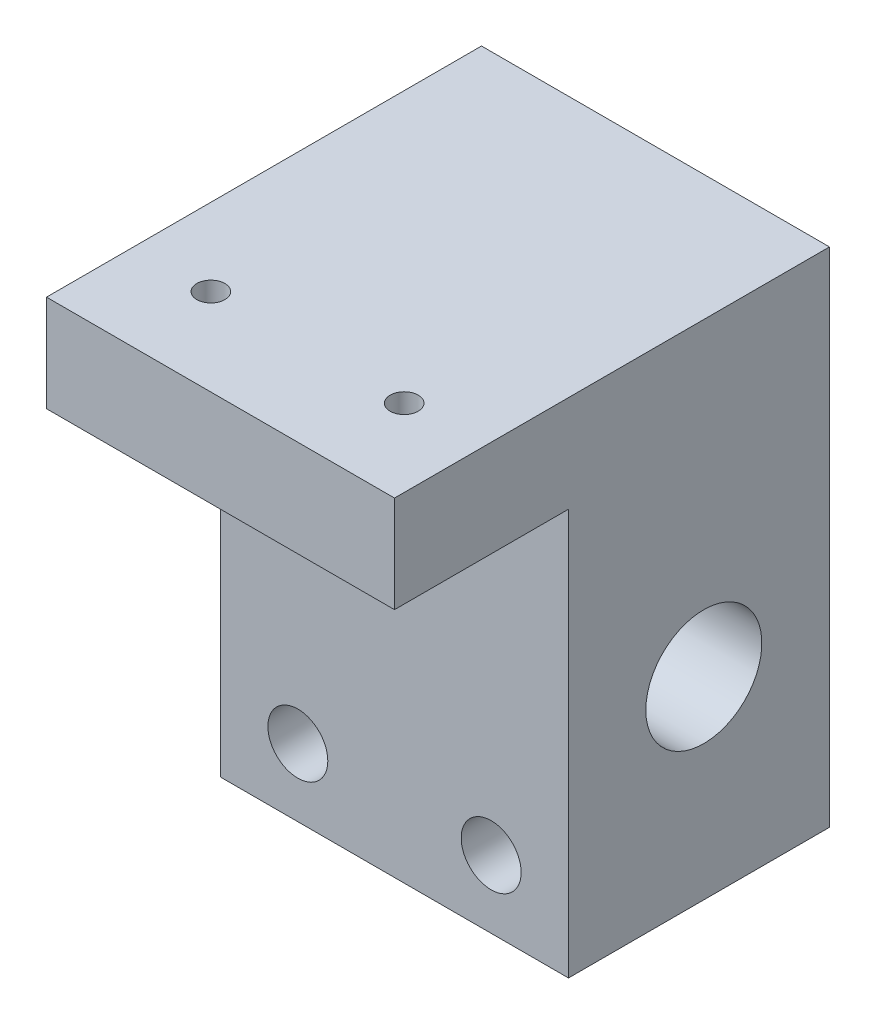
ISO-10303-21;
HEADER;
FILE_DESCRIPTION(('STEP AP214'),'2;1');
FILE_NAME('part.step','',(''),(''),'','','');
FILE_SCHEMA(('AUTOMOTIVE_DESIGN { 1 0 10303 214 1 1 1 1 }'));
ENDSEC;
DATA;
#1=APPLICATION_CONTEXT('core data for automotive mechanical design processes');
#2=APPLICATION_PROTOCOL_DEFINITION('international standard','automotive_design',2000,#1);
#3=PRODUCT_CONTEXT('',#1,'mechanical');
#4=PRODUCT('Part','Part','',(#3));
#5=PRODUCT_RELATED_PRODUCT_CATEGORY('part','',(#4));
#6=PRODUCT_DEFINITION_FORMATION('','',#4);
#7=PRODUCT_DEFINITION_CONTEXT('part definition',#1,'design');
#8=PRODUCT_DEFINITION('design','',#6,#7);
#9=PRODUCT_DEFINITION_SHAPE('','',#8);
#10=(LENGTH_UNIT() NAMED_UNIT(*) SI_UNIT(.MILLI.,.METRE.));
#11=(NAMED_UNIT(*) PLANE_ANGLE_UNIT() SI_UNIT($,.RADIAN.));
#12=(NAMED_UNIT(*) SI_UNIT($,.STERADIAN.) SOLID_ANGLE_UNIT());
#13=UNCERTAINTY_MEASURE_WITH_UNIT(LENGTH_MEASURE(1.E-05),#10,'distance_accuracy_value','');
#14=(GEOMETRIC_REPRESENTATION_CONTEXT(3) GLOBAL_UNCERTAINTY_ASSIGNED_CONTEXT((#13)) GLOBAL_UNIT_ASSIGNED_CONTEXT((#10,
#11,#12)) REPRESENTATION_CONTEXT('',''));
#15=CARTESIAN_POINT('',(0.,0.,0.));
#16=DIRECTION('',(0.,0.,1.));
#17=DIRECTION('',(1.,0.,0.));
#18=AXIS2_PLACEMENT_3D('',#15,#16,#17);
#19=CARTESIAN_POINT('',(0.,55.,0.));
#20=DIRECTION('',(0.,0.,-1.));
#21=DIRECTION('',(-1.,0.,0.));
#22=AXIS2_PLACEMENT_3D('',#19,#20,#21);
#23=PLANE('',#22);
#24=CARTESIAN_POINT('',(8.,10.,0.));
#25=DIRECTION('',(0.,0.,1.));
#26=DIRECTION('',(1.,0.,0.));
#27=AXIS2_PLACEMENT_3D('',#24,#25,#26);
#28=CIRCLE('',#27,3.1);
#29=CARTESIAN_POINT('',(11.1,10.,0.));
#30=VERTEX_POINT('',#29);
#31=EDGE_CURVE('E241',#30,#30,#28,.T.);
#32=ORIENTED_EDGE('',*,*,#31,.F.);
#33=EDGE_LOOP('',(#32));
#34=FACE_BOUND('',#33,.T.);
#35=CARTESIAN_POINT('',(28.,10.,0.));
#36=DIRECTION('',(0.,0.,1.));
#37=DIRECTION('',(1.,0.,0.));
#38=AXIS2_PLACEMENT_3D('',#35,#36,#37);
#39=CIRCLE('',#38,3.1);
#40=CARTESIAN_POINT('',(31.1,10.,0.));
#41=VERTEX_POINT('',#40);
#42=EDGE_CURVE('E245',#41,#41,#39,.T.);
#43=ORIENTED_EDGE('',*,*,#42,.F.);
#44=EDGE_LOOP('',(#43));
#45=FACE_BOUND('',#44,.T.);
#46=DIRECTION('',(-1.,0.,0.));
#47=VECTOR('',#46,1.);
#48=CARTESIAN_POINT('',(36.,3.,0.));
#49=LINE('',#48,#47);
#50=CARTESIAN_POINT('',(36.,3.,0.));
#51=VERTEX_POINT('',#50);
#52=CARTESIAN_POINT('',(0.,3.,0.));
#53=VERTEX_POINT('',#52);
#54=EDGE_CURVE('E95',#51,#53,#49,.T.);
#55=ORIENTED_EDGE('',*,*,#54,.F.);
#56=DIRECTION('',(0.,-1.,0.));
#57=VECTOR('',#56,1.);
#58=CARTESIAN_POINT('',(36.,55.,0.));
#59=LINE('',#58,#57);
#60=CARTESIAN_POINT('',(36.,45.,0.));
#61=VERTEX_POINT('',#60);
#62=EDGE_CURVE('E52',#61,#51,#59,.T.);
#63=ORIENTED_EDGE('',*,*,#62,.F.);
#64=DIRECTION('',(1.,0.,0.));
#65=VECTOR('',#64,1.);
#66=CARTESIAN_POINT('',(-20.591260281974,45.,0.));
#67=LINE('',#66,#65);
#68=CARTESIAN_POINT('',(0.,45.,0.));
#69=VERTEX_POINT('',#68);
#70=EDGE_CURVE('E66',#69,#61,#67,.T.);
#71=ORIENTED_EDGE('',*,*,#70,.F.);
#72=DIRECTION('',(0.,-1.,0.));
#73=VECTOR('',#72,1.);
#74=CARTESIAN_POINT('',(0.,55.,0.));
#75=LINE('',#74,#73);
#76=EDGE_CURVE('E11',#69,#53,#75,.T.);
#77=ORIENTED_EDGE('',*,*,#76,.T.);
#78=EDGE_LOOP('',(#55,#63,#71,#77));
#79=FACE_BOUND('',#78,.T.);
#80=ADVANCED_FACE('F43',(#34,#45,#79),#23,.F.);
#81=CARTESIAN_POINT('',(0.,55.,0.));
#82=DIRECTION('',(1.,0.,0.));
#83=DIRECTION('',(0.,0.,-1.));
#84=AXIS2_PLACEMENT_3D('',#81,#82,#83);
#85=PLANE('',#84);
#86=CARTESIAN_POINT('',(0.,23.,-14.));
#87=DIRECTION('',(-1.,0.,0.));
#88=DIRECTION('',(0.,0.,1.));
#89=AXIS2_PLACEMENT_3D('',#86,#87,#88);
#90=CIRCLE('',#89,6.);
#91=CARTESIAN_POINT('',(0.,23.,-8.));
#92=VERTEX_POINT('',#91);
#93=EDGE_CURVE('E240',#92,#92,#90,.T.);
#94=ORIENTED_EDGE('',*,*,#93,.F.);
#95=EDGE_LOOP('',(#94));
#96=FACE_BOUND('',#95,.T.);
#97=DIRECTION('',(0.,0.,-1.));
#98=VECTOR('',#97,1.);
#99=CARTESIAN_POINT('',(0.,3.,0.));
#100=LINE('',#99,#98);
#101=CARTESIAN_POINT('',(0.,3.,-27.));
#102=VERTEX_POINT('',#101);
#103=EDGE_CURVE('E59',#53,#102,#100,.T.);
#104=ORIENTED_EDGE('',*,*,#103,.F.);
#105=ORIENTED_EDGE('',*,*,#76,.F.);
#106=DIRECTION('',(0.,0.,1.));
#107=VECTOR('',#106,1.);
#108=CARTESIAN_POINT('',(0.,45.,0.));
#109=LINE('',#108,#107);
#110=CARTESIAN_POINT('',(0.,45.,18.));
#111=VERTEX_POINT('',#110);
#112=EDGE_CURVE('E216',#69,#111,#109,.T.);
#113=ORIENTED_EDGE('',*,*,#112,.T.);
#114=DIRECTION('',(0.,1.,0.));
#115=VECTOR('',#114,1.);
#116=CARTESIAN_POINT('',(0.,55.,18.));
#117=LINE('',#116,#115);
#118=CARTESIAN_POINT('',(0.,55.,18.));
#119=VERTEX_POINT('',#118);
#120=EDGE_CURVE('E212',#111,#119,#117,.T.);
#121=ORIENTED_EDGE('',*,*,#120,.T.);
#122=DIRECTION('',(0.,0.,1.));
#123=VECTOR('',#122,1.);
#124=CARTESIAN_POINT('',(0.,55.,0.));
#125=LINE('',#124,#123);
#126=CARTESIAN_POINT('',(0.,55.,-27.));
#127=VERTEX_POINT('',#126);
#128=EDGE_CURVE('E259',#127,#119,#125,.T.);
#129=ORIENTED_EDGE('',*,*,#128,.F.);
#130=DIRECTION('',(0.,1.,0.));
#131=VECTOR('',#130,1.);
#132=CARTESIAN_POINT('',(0.,0.,-27.));
#133=LINE('',#132,#131);
#134=EDGE_CURVE('E107',#102,#127,#133,.T.);
#135=ORIENTED_EDGE('',*,*,#134,.F.);
#136=EDGE_LOOP('',(#104,#105,#113,#121,#129,#135));
#137=FACE_BOUND('',#136,.T.);
#138=ADVANCED_FACE('F45',(#96,#137),#85,.F.);
#139=CARTESIAN_POINT('',(36.,55.,0.));
#140=DIRECTION('',(-1.,0.,0.));
#141=DIRECTION('',(0.,0.,1.));
#142=AXIS2_PLACEMENT_3D('',#139,#140,#141);
#143=PLANE('',#142);
#144=CARTESIAN_POINT('',(36.,23.,-14.));
#145=DIRECTION('',(-1.,0.,0.));
#146=DIRECTION('',(0.,0.,1.));
#147=AXIS2_PLACEMENT_3D('',#144,#145,#146);
#148=CIRCLE('',#147,6.);
#149=CARTESIAN_POINT('',(36.,23.,-8.));
#150=VERTEX_POINT('',#149);
#151=EDGE_CURVE('E255',#150,#150,#148,.F.);
#152=ORIENTED_EDGE('',*,*,#151,.F.);
#153=EDGE_LOOP('',(#152));
#154=FACE_BOUND('',#153,.T.);
#155=DIRECTION('',(0.,0.,1.));
#156=VECTOR('',#155,1.);
#157=CARTESIAN_POINT('',(36.,3.,-27.));
#158=LINE('',#157,#156);
#159=CARTESIAN_POINT('',(36.,3.,-27.));
#160=VERTEX_POINT('',#159);
#161=EDGE_CURVE('E98',#160,#51,#158,.T.);
#162=ORIENTED_EDGE('',*,*,#161,.F.);
#163=DIRECTION('',(0.,-1.,0.));
#164=VECTOR('',#163,1.);
#165=CARTESIAN_POINT('',(36.,55.,-27.));
#166=LINE('',#165,#164);
#167=CARTESIAN_POINT('',(36.,55.,-27.));
#168=VERTEX_POINT('',#167);
#169=EDGE_CURVE('E189',#168,#160,#166,.T.);
#170=ORIENTED_EDGE('',*,*,#169,.F.);
#171=DIRECTION('',(0.,0.,-1.));
#172=VECTOR('',#171,1.);
#173=CARTESIAN_POINT('',(36.,55.,0.));
#174=LINE('',#173,#172);
#175=CARTESIAN_POINT('',(36.,55.,18.));
#176=VERTEX_POINT('',#175);
#177=EDGE_CURVE('E262',#176,#168,#174,.T.);
#178=ORIENTED_EDGE('',*,*,#177,.F.);
#179=DIRECTION('',(0.,-1.,0.));
#180=VECTOR('',#179,1.);
#181=CARTESIAN_POINT('',(36.,55.,18.));
#182=LINE('',#181,#180);
#183=CARTESIAN_POINT('',(36.,45.,18.));
#184=VERTEX_POINT('',#183);
#185=EDGE_CURVE('E204',#176,#184,#182,.T.);
#186=ORIENTED_EDGE('',*,*,#185,.T.);
#187=DIRECTION('',(0.,0.,-1.));
#188=VECTOR('',#187,1.);
#189=CARTESIAN_POINT('',(36.,45.,0.));
#190=LINE('',#189,#188);
#191=EDGE_CURVE('E223',#184,#61,#190,.T.);
#192=ORIENTED_EDGE('',*,*,#191,.T.);
#193=ORIENTED_EDGE('',*,*,#62,.T.);
#194=EDGE_LOOP('',(#162,#170,#178,#186,#192,#193));
#195=FACE_BOUND('',#194,.T.);
#196=ADVANCED_FACE('F116',(#154,#195),#143,.F.);
#197=CARTESIAN_POINT('',(0.,0.,-27.));
#198=DIRECTION('',(0.,0.,-1.));
#199=DIRECTION('',(-1.,0.,0.));
#200=AXIS2_PLACEMENT_3D('',#197,#198,#199);
#201=PLANE('',#200);
#202=ORIENTED_EDGE('',*,*,#169,.T.);
#203=DIRECTION('',(1.,0.,0.));
#204=VECTOR('',#203,1.);
#205=CARTESIAN_POINT('',(0.,3.,-27.));
#206=LINE('',#205,#204);
#207=EDGE_CURVE('E109',#102,#160,#206,.T.);
#208=ORIENTED_EDGE('',*,*,#207,.F.);
#209=ORIENTED_EDGE('',*,*,#134,.T.);
#210=DIRECTION('',(1.,0.,0.));
#211=VECTOR('',#210,1.);
#212=CARTESIAN_POINT('',(0.,55.,-27.));
#213=LINE('',#212,#211);
#214=EDGE_CURVE('E195',#127,#168,#213,.T.);
#215=ORIENTED_EDGE('',*,*,#214,.T.);
#216=EDGE_LOOP('',(#202,#208,#209,#215));
#217=FACE_BOUND('',#216,.T.);
#218=ADVANCED_FACE('F123',(#217),#201,.T.);
#219=CARTESIAN_POINT('',(0.,55.,0.));
#220=DIRECTION('',(0.,-1.,0.));
#221=DIRECTION('',(0.,0.,-1.));
#222=AXIS2_PLACEMENT_3D('',#219,#220,#221);
#223=PLANE('',#222);
#224=CARTESIAN_POINT('',(28.,55.,9.));
#225=DIRECTION('',(0.,1.,0.));
#226=DIRECTION('',(0.,0.,1.));
#227=AXIS2_PLACEMENT_3D('',#224,#225,#226);
#228=CIRCLE('',#227,1.45);
#229=CARTESIAN_POINT('',(28.,55.,10.45));
#230=VERTEX_POINT('',#229);
#231=EDGE_CURVE('E205',#230,#230,#228,.T.);
#232=ORIENTED_EDGE('',*,*,#231,.F.);
#233=EDGE_LOOP('',(#232));
#234=FACE_BOUND('',#233,.T.);
#235=CARTESIAN_POINT('',(8.,55.,9.));
#236=DIRECTION('',(0.,1.,0.));
#237=DIRECTION('',(0.,0.,1.));
#238=AXIS2_PLACEMENT_3D('',#235,#236,#237);
#239=CIRCLE('',#238,1.45);
#240=CARTESIAN_POINT('',(8.,55.,10.45));
#241=VERTEX_POINT('',#240);
#242=EDGE_CURVE('E199',#241,#241,#239,.T.);
#243=ORIENTED_EDGE('',*,*,#242,.F.);
#244=EDGE_LOOP('',(#243));
#245=FACE_BOUND('',#244,.T.);
#246=ORIENTED_EDGE('',*,*,#128,.T.);
#247=DIRECTION('',(1.,0.,0.));
#248=VECTOR('',#247,1.);
#249=CARTESIAN_POINT('',(-20.591260281974,55.,18.));
#250=LINE('',#249,#248);
#251=EDGE_CURVE('E227',#119,#176,#250,.T.);
#252=ORIENTED_EDGE('',*,*,#251,.T.);
#253=ORIENTED_EDGE('',*,*,#177,.T.);
#254=ORIENTED_EDGE('',*,*,#214,.F.);
#255=EDGE_LOOP('',(#246,#252,#253,#254));
#256=FACE_BOUND('',#255,.T.);
#257=ADVANCED_FACE('F125',(#234,#245,#256),#223,.F.);
#258=CARTESIAN_POINT('',(52.9705627484771,23.,-14.));
#259=DIRECTION('',(-1.,0.,0.));
#260=DIRECTION('',(0.,0.,1.));
#261=AXIS2_PLACEMENT_3D('',#258,#259,#260);
#262=CYLINDRICAL_SURFACE('',#261,6.);
#263=ORIENTED_EDGE('',*,*,#151,.T.);
#264=EDGE_LOOP('',(#263));
#265=FACE_BOUND('',#264,.T.);
#266=ORIENTED_EDGE('',*,*,#93,.T.);
#267=EDGE_LOOP('',(#266));
#268=FACE_BOUND('',#267,.T.);
#269=ADVANCED_FACE('F128',(#265,#268),#262,.F.);
#270=CARTESIAN_POINT('',(28.,10.,-6.));
#271=DIRECTION('',(0.,0.,1.));
#272=DIRECTION('',(1.,0.,0.));
#273=AXIS2_PLACEMENT_3D('',#270,#271,#272);
#274=CYLINDRICAL_SURFACE('',#273,3.1);
#275=CARTESIAN_POINT('',(28.,10.,-6.));
#276=DIRECTION('',(0.,0.,1.));
#277=DIRECTION('',(1.,0.,0.));
#278=AXIS2_PLACEMENT_3D('',#275,#276,#277);
#279=CIRCLE('',#278,3.1);
#280=CARTESIAN_POINT('',(31.1,10.,-6.));
#281=VERTEX_POINT('',#280);
#282=EDGE_CURVE('E219',#281,#281,#279,.T.);
#283=ORIENTED_EDGE('',*,*,#282,.F.);
#284=EDGE_LOOP('',(#283));
#285=FACE_BOUND('',#284,.T.);
#286=ORIENTED_EDGE('',*,*,#42,.T.);
#287=EDGE_LOOP('',(#286));
#288=FACE_BOUND('',#287,.T.);
#289=ADVANCED_FACE('F132',(#285,#288),#274,.F.);
#290=CARTESIAN_POINT('',(28.,10.,-6.));
#291=DIRECTION('',(0.,0.,1.));
#292=DIRECTION('',(1.,0.,0.));
#293=AXIS2_PLACEMENT_3D('',#290,#291,#292);
#294=PLANE('',#293);
#295=ORIENTED_EDGE('',*,*,#282,.T.);
#296=EDGE_LOOP('',(#295));
#297=FACE_BOUND('',#296,.T.);
#298=ADVANCED_FACE('F134',(#297),#294,.T.);
#299=CARTESIAN_POINT('',(8.,10.,-6.));
#300=DIRECTION('',(0.,0.,1.));
#301=DIRECTION('',(1.,0.,0.));
#302=AXIS2_PLACEMENT_3D('',#299,#300,#301);
#303=CYLINDRICAL_SURFACE('',#302,3.1);
#304=CARTESIAN_POINT('',(8.,10.,-6.));
#305=DIRECTION('',(0.,0.,1.));
#306=DIRECTION('',(1.,0.,0.));
#307=AXIS2_PLACEMENT_3D('',#304,#305,#306);
#308=CIRCLE('',#307,3.1);
#309=CARTESIAN_POINT('',(11.1,10.,-6.));
#310=VERTEX_POINT('',#309);
#311=EDGE_CURVE('E236',#310,#310,#308,.T.);
#312=ORIENTED_EDGE('',*,*,#311,.F.);
#313=EDGE_LOOP('',(#312));
#314=FACE_BOUND('',#313,.T.);
#315=ORIENTED_EDGE('',*,*,#31,.T.);
#316=EDGE_LOOP('',(#315));
#317=FACE_BOUND('',#316,.T.);
#318=ADVANCED_FACE('F137',(#314,#317),#303,.F.);
#319=CARTESIAN_POINT('',(8.,10.,-6.));
#320=DIRECTION('',(0.,0.,1.));
#321=DIRECTION('',(1.,0.,0.));
#322=AXIS2_PLACEMENT_3D('',#319,#320,#321);
#323=PLANE('',#322);
#324=ORIENTED_EDGE('',*,*,#311,.T.);
#325=EDGE_LOOP('',(#324));
#326=FACE_BOUND('',#325,.T.);
#327=ADVANCED_FACE('F144',(#326),#323,.T.);
#328=CARTESIAN_POINT('',(-20.591260281974,45.,0.));
#329=DIRECTION('',(0.,-1.,0.));
#330=DIRECTION('',(0.,0.,-1.));
#331=AXIS2_PLACEMENT_3D('',#328,#329,#330);
#332=PLANE('',#331);
#333=ORIENTED_EDGE('',*,*,#112,.F.);
#334=ORIENTED_EDGE('',*,*,#70,.T.);
#335=ORIENTED_EDGE('',*,*,#191,.F.);
#336=DIRECTION('',(1.,0.,0.));
#337=VECTOR('',#336,1.);
#338=CARTESIAN_POINT('',(-20.591260281974,45.,18.));
#339=LINE('',#338,#337);
#340=EDGE_CURVE('E230',#111,#184,#339,.T.);
#341=ORIENTED_EDGE('',*,*,#340,.F.);
#342=EDGE_LOOP('',(#333,#334,#335,#341));
#343=FACE_BOUND('',#342,.T.);
#344=ADVANCED_FACE('F148',(#343),#332,.T.);
#345=CARTESIAN_POINT('',(-20.591260281974,55.,18.));
#346=DIRECTION('',(0.,0.,1.));
#347=DIRECTION('',(1.,0.,0.));
#348=AXIS2_PLACEMENT_3D('',#345,#346,#347);
#349=PLANE('',#348);
#350=ORIENTED_EDGE('',*,*,#120,.F.);
#351=ORIENTED_EDGE('',*,*,#340,.T.);
#352=ORIENTED_EDGE('',*,*,#185,.F.);
#353=ORIENTED_EDGE('',*,*,#251,.F.);
#354=EDGE_LOOP('',(#350,#351,#352,#353));
#355=FACE_BOUND('',#354,.T.);
#356=ADVANCED_FACE('F150',(#355),#349,.T.);
#357=CARTESIAN_POINT('',(8.,50.,9.));
#358=DIRECTION('',(0.,1.,0.));
#359=DIRECTION('',(0.,0.,1.));
#360=AXIS2_PLACEMENT_3D('',#357,#358,#359);
#361=CYLINDRICAL_SURFACE('',#360,1.45);
#362=ORIENTED_EDGE('',*,*,#242,.T.);
#363=EDGE_LOOP('',(#362));
#364=FACE_BOUND('',#363,.T.);
#365=CARTESIAN_POINT('',(8.,48.5,9.));
#366=DIRECTION('',(0.,1.,0.));
#367=DIRECTION('',(0.,0.,1.));
#368=AXIS2_PLACEMENT_3D('',#365,#366,#367);
#369=CIRCLE('',#368,1.45);
#370=CARTESIAN_POINT('',(8.,48.5,10.45));
#371=VERTEX_POINT('',#370);
#372=EDGE_CURVE('E101',#371,#371,#369,.T.);
#373=ORIENTED_EDGE('',*,*,#372,.F.);
#374=EDGE_LOOP('',(#373));
#375=FACE_BOUND('',#374,.T.);
#376=ADVANCED_FACE('F153',(#364,#375),#361,.F.);
#377=CARTESIAN_POINT('',(28.,50.,9.));
#378=DIRECTION('',(0.,1.,0.));
#379=DIRECTION('',(0.,0.,1.));
#380=AXIS2_PLACEMENT_3D('',#377,#378,#379);
#381=CYLINDRICAL_SURFACE('',#380,1.45);
#382=CARTESIAN_POINT('',(28.,50.,9.));
#383=DIRECTION('',(0.,1.,0.));
#384=DIRECTION('',(0.,0.,1.));
#385=AXIS2_PLACEMENT_3D('',#382,#383,#384);
#386=CIRCLE('',#385,1.45);
#387=CARTESIAN_POINT('',(28.,50.,10.45));
#388=VERTEX_POINT('',#387);
#389=EDGE_CURVE('E200',#388,#388,#386,.T.);
#390=ORIENTED_EDGE('',*,*,#389,.F.);
#391=EDGE_LOOP('',(#390));
#392=FACE_BOUND('',#391,.T.);
#393=ORIENTED_EDGE('',*,*,#231,.T.);
#394=EDGE_LOOP('',(#393));
#395=FACE_BOUND('',#394,.T.);
#396=ADVANCED_FACE('F160',(#392,#395),#381,.F.);
#397=CARTESIAN_POINT('',(28.,50.,9.));
#398=DIRECTION('',(0.,1.,0.));
#399=DIRECTION('',(0.,0.,1.));
#400=AXIS2_PLACEMENT_3D('',#397,#398,#399);
#401=PLANE('',#400);
#402=ORIENTED_EDGE('',*,*,#389,.T.);
#403=EDGE_LOOP('',(#402));
#404=FACE_BOUND('',#403,.T.);
#405=ADVANCED_FACE('F164',(#404),#401,.T.);
#406=CARTESIAN_POINT('',(0.,3.,0.));
#407=DIRECTION('',(0.,-1.,0.));
#408=DIRECTION('',(0.,0.,-1.));
#409=AXIS2_PLACEMENT_3D('',#406,#407,#408);
#410=PLANE('',#409);
#411=ORIENTED_EDGE('',*,*,#54,.T.);
#412=ORIENTED_EDGE('',*,*,#103,.T.);
#413=ORIENTED_EDGE('',*,*,#207,.T.);
#414=ORIENTED_EDGE('',*,*,#161,.T.);
#415=EDGE_LOOP('',(#411,#412,#413,#414));
#416=FACE_BOUND('',#415,.T.);
#417=ADVANCED_FACE('F96',(#416),#410,.T.);
#418=CARTESIAN_POINT('',(8.,48.5,9.));
#419=DIRECTION('',(0.,1.,0.));
#420=DIRECTION('',(0.,0.,1.));
#421=AXIS2_PLACEMENT_3D('',#418,#419,#420);
#422=PLANE('',#421);
#423=ORIENTED_EDGE('',*,*,#372,.T.);
#424=EDGE_LOOP('',(#423));
#425=FACE_BOUND('',#424,.T.);
#426=ADVANCED_FACE('F174',(#425),#422,.T.);
#427=CLOSED_SHELL('',(#80,#138,#196,#218,#257,#269,#289,#298,#318,#327,#344,#356,#376,#396,#405,
#417,#426));
#428=MANIFOLD_SOLID_BREP('B2',#427);
#429=ADVANCED_BREP_SHAPE_REPRESENTATION('',(#18,#428),#14);
#430=SHAPE_DEFINITION_REPRESENTATION(#9,#429);
ENDSEC;
END-ISO-10303-21;
